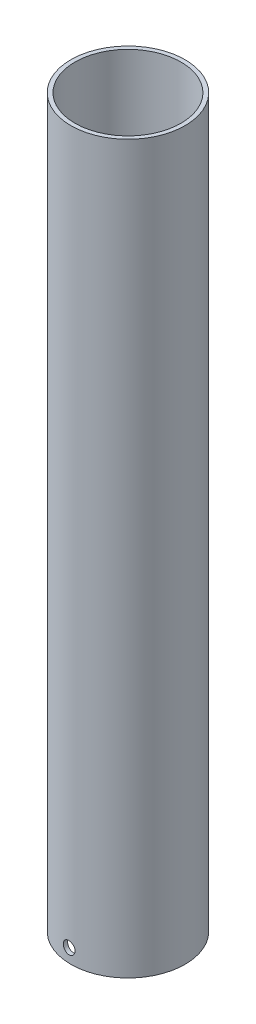
ISO-10303-21;
HEADER;
FILE_DESCRIPTION(('STEP AP214'),'2;1');
FILE_NAME('part.step','',(''),(''),'','','');
FILE_SCHEMA(('AUTOMOTIVE_DESIGN { 1 0 10303 214 1 1 1 1 }'));
ENDSEC;
DATA;
#1=APPLICATION_CONTEXT('core data for automotive mechanical design processes');
#2=APPLICATION_PROTOCOL_DEFINITION('international standard','automotive_design',2000,#1);
#3=PRODUCT_CONTEXT('',#1,'mechanical');
#4=PRODUCT('Part','Part','',(#3));
#5=PRODUCT_RELATED_PRODUCT_CATEGORY('part','',(#4));
#6=PRODUCT_DEFINITION_FORMATION('','',#4);
#7=PRODUCT_DEFINITION_CONTEXT('part definition',#1,'design');
#8=PRODUCT_DEFINITION('design','',#6,#7);
#9=PRODUCT_DEFINITION_SHAPE('','',#8);
#10=(LENGTH_UNIT() NAMED_UNIT(*) SI_UNIT(.MILLI.,.METRE.));
#11=(NAMED_UNIT(*) PLANE_ANGLE_UNIT() SI_UNIT($,.RADIAN.));
#12=(NAMED_UNIT(*) SI_UNIT($,.STERADIAN.) SOLID_ANGLE_UNIT());
#13=UNCERTAINTY_MEASURE_WITH_UNIT(LENGTH_MEASURE(1.E-05),#10,'distance_accuracy_value','');
#14=(GEOMETRIC_REPRESENTATION_CONTEXT(3) GLOBAL_UNCERTAINTY_ASSIGNED_CONTEXT((#13)) GLOBAL_UNIT_ASSIGNED_CONTEXT((#10,
#11,#12)) REPRESENTATION_CONTEXT('',''));
#15=CARTESIAN_POINT('',(0.,0.,0.));
#16=DIRECTION('',(0.,0.,1.));
#17=DIRECTION('',(1.,0.,0.));
#18=AXIS2_PLACEMENT_3D('',#15,#16,#17);
#19=CARTESIAN_POINT('',(0.,178.,0.));
#20=DIRECTION('',(0.,1.,0.));
#21=DIRECTION('',(0.,0.,1.));
#22=AXIS2_PLACEMENT_3D('',#19,#20,#21);
#23=PLANE('',#22);
#24=CARTESIAN_POINT('',(0.,178.,0.));
#25=DIRECTION('',(0.,1.,0.));
#26=DIRECTION('',(0.,0.,1.));
#27=AXIS2_PLACEMENT_3D('',#24,#25,#26);
#28=CIRCLE('',#27,14.);
#29=CARTESIAN_POINT('',(0.,178.,14.));
#30=VERTEX_POINT('',#29);
#31=EDGE_CURVE('E10',#30,#30,#28,.T.);
#32=ORIENTED_EDGE('',*,*,#31,.T.);
#33=EDGE_LOOP('',(#32));
#34=FACE_BOUND('',#33,.T.);
#35=CARTESIAN_POINT('',(0.,178.,0.));
#36=DIRECTION('',(0.,1.,0.));
#37=DIRECTION('',(0.,0.,1.));
#38=AXIS2_PLACEMENT_3D('',#35,#36,#37);
#39=CIRCLE('',#38,13.);
#40=CARTESIAN_POINT('',(0.,178.,13.));
#41=VERTEX_POINT('',#40);
#42=EDGE_CURVE('E51',#41,#41,#39,.T.);
#43=ORIENTED_EDGE('',*,*,#42,.F.);
#44=EDGE_LOOP('',(#43));
#45=FACE_BOUND('',#44,.T.);
#46=ADVANCED_FACE('F32',(#34,#45),#23,.T.);
#47=CARTESIAN_POINT('',(0.,0.,0.));
#48=DIRECTION('',(0.,1.,0.));
#49=DIRECTION('',(0.,0.,1.));
#50=AXIS2_PLACEMENT_3D('',#47,#48,#49);
#51=PLANE('',#50);
#52=CARTESIAN_POINT('',(0.,0.,0.));
#53=DIRECTION('',(0.,1.,0.));
#54=DIRECTION('',(0.,0.,1.));
#55=AXIS2_PLACEMENT_3D('',#52,#53,#54);
#56=CIRCLE('',#55,14.);
#57=CARTESIAN_POINT('',(0.,0.,14.));
#58=VERTEX_POINT('',#57);
#59=EDGE_CURVE('E46',#58,#58,#56,.T.);
#60=ORIENTED_EDGE('',*,*,#59,.F.);
#61=EDGE_LOOP('',(#60));
#62=FACE_BOUND('',#61,.T.);
#63=CARTESIAN_POINT('',(0.,0.,0.));
#64=DIRECTION('',(0.,1.,0.));
#65=DIRECTION('',(0.,0.,1.));
#66=AXIS2_PLACEMENT_3D('',#63,#64,#65);
#67=CIRCLE('',#66,13.);
#68=CARTESIAN_POINT('',(0.,0.,13.));
#69=VERTEX_POINT('',#68);
#70=EDGE_CURVE('E54',#69,#69,#67,.T.);
#71=ORIENTED_EDGE('',*,*,#70,.T.);
#72=EDGE_LOOP('',(#71));
#73=FACE_BOUND('',#72,.T.);
#74=ADVANCED_FACE('F90',(#62,#73),#51,.F.);
#75=CARTESIAN_POINT('',(0.,178.,0.));
#76=DIRECTION('',(0.,-1.,0.));
#77=DIRECTION('',(0.,0.,-1.));
#78=AXIS2_PLACEMENT_3D('',#75,#76,#77);
#79=CYLINDRICAL_SURFACE('',#78,14.);
#80=CARTESIAN_POINT('',(0.,4.72088876512511,-14.));
#81=CARTESIAN_POINT('',(-0.0797635108235447,4.69339310558107,-13.9999992620599));
#82=CARTESIAN_POINT('',(-0.157260112589885,4.6591483632393,-13.9993120308647));
#83=CARTESIAN_POINT('',(-0.305464442159809,4.57813640790885,-13.9968642446644));
#84=CARTESIAN_POINT('',(-0.376164291097724,4.53135489443288,-13.9951024609884));
#85=CARTESIAN_POINT('',(-0.508677268794628,4.42664071286015,-13.9909128932974));
#86=CARTESIAN_POINT('',(-0.570495475391909,4.36871446113652,-13.9884854921587));
#87=CARTESIAN_POINT('',(-0.683525453825599,4.24333668313493,-13.9834188317392));
#88=CARTESIAN_POINT('',(-0.734739647028978,4.17588733733158,-13.9807796210152));
#89=CARTESIAN_POINT('',(-0.825195653870934,4.03322366325164,-13.9757330707817));
#90=CARTESIAN_POINT('',(-0.864417896339043,3.95799690691231,-13.973326114652));
#91=CARTESIAN_POINT('',(-0.929634536073645,3.80199314221514,-13.9691393435771));
#92=CARTESIAN_POINT('',(-0.955628824158422,3.72121608805215,-13.9673595338084));
#93=CARTESIAN_POINT('',(-0.993544532232519,3.5567362052991,-13.9647138443585));
#94=CARTESIAN_POINT('',(-1.0055196505497,3.47304581347829,-13.9638444787167));
#95=CARTESIAN_POINT('',(-1.01521977999673,3.30484017097782,-13.9631426872178));
#96=CARTESIAN_POINT('',(-1.01294521301607,3.22032494479294,-13.9633102306608));
#97=CARTESIAN_POINT('',(-0.994254882840361,3.05324277420335,-13.9646533148128));
#98=CARTESIAN_POINT('',(-0.977898501918738,2.97066914231391,-13.9658246226042));
#99=CARTESIAN_POINT('',(-0.931607159050394,2.80943753915253,-13.9689885706454));
#100=CARTESIAN_POINT('',(-0.901672031750464,2.73077961557651,-13.9709812208968));
#101=CARTESIAN_POINT('',(-0.829019251407501,2.57943031313419,-13.9754802306145));
#102=CARTESIAN_POINT('',(-0.786276096277451,2.50675121015375,-13.9779876117961));
#103=CARTESIAN_POINT('',(-0.689250321120806,2.36955673049665,-13.9831071771594));
#104=CARTESIAN_POINT('',(-0.634967296381392,2.30504164026534,-13.985719365014));
#105=CARTESIAN_POINT('',(-0.516087795436752,2.18566364677829,-13.990611205319));
#106=CARTESIAN_POINT('',(-0.451440394237031,2.13085137133377,-13.9928891035237));
#107=CARTESIAN_POINT('',(-0.313856535832561,2.03282882786167,-13.9966503820047));
#108=CARTESIAN_POINT('',(-0.240920068699055,1.98961857373134,-13.9981337613291));
#109=CARTESIAN_POINT('',(-0.0888003717115231,1.91602607546538,-13.9999248218657));
#110=CARTESIAN_POINT('',(-0.0096155331312365,1.88564714779878,-14.0002321992859));
#111=CARTESIAN_POINT('',(0.152724120647779,1.83862046506263,-13.9994020828519));
#112=CARTESIAN_POINT('',(0.235878800351517,1.82197224170318,-13.9982646382772));
#113=CARTESIAN_POINT('',(0.403355210195504,1.80294518466807,-13.9944376261198));
#114=CARTESIAN_POINT('',(0.48766920026805,1.80049665303678,-13.9917557109401));
#115=CARTESIAN_POINT('',(0.655453965316559,1.80975449158445,-13.9849000832809));
#116=CARTESIAN_POINT('',(0.73892475368215,1.82146063663668,-13.9807263945286));
#117=CARTESIAN_POINT('',(0.902451042795877,1.85863734024548,-13.971123016801));
#118=CARTESIAN_POINT('',(0.982514335215304,1.88407444915151,-13.9656963983649));
#119=CARTESIAN_POINT('',(1.13720116607759,1.94795622334032,-13.9539527075128));
#120=CARTESIAN_POINT('',(1.21182456576847,1.98640122026624,-13.947635612396));
#121=CARTESIAN_POINT('',(1.35383631181547,2.07537745417889,-13.9345699027685));
#122=CARTESIAN_POINT('',(1.42119604677487,2.12595412514893,-13.9278197377061));
#123=CARTESIAN_POINT('',(1.54649161490082,2.23769381509673,-13.9144651891281));
#124=CARTESIAN_POINT('',(1.60442717872748,2.29885713653461,-13.9078608097837));
#125=CARTESIAN_POINT('',(1.70948874828973,2.43034079625818,-13.8953397495995));
#126=CARTESIAN_POINT('',(1.75656864151849,2.50069827810975,-13.8894260532269));
#127=CARTESIAN_POINT('',(1.83827748839958,2.64839199160633,-13.8788486736999));
#128=CARTESIAN_POINT('',(1.87290661305541,2.72572812738564,-13.8741849733778));
#129=CARTESIAN_POINT('',(1.92866610451736,2.88503244955425,-13.8665440158583));
#130=CARTESIAN_POINT('',(1.94982275141657,2.96699127644176,-13.8635634766963));
#131=CARTESIAN_POINT('',(1.97812823092718,3.13333860545741,-13.8595532509254));
#132=CARTESIAN_POINT('',(1.98527756989194,3.21772701964595,-13.8585234937971));
#133=CARTESIAN_POINT('',(1.98535970270921,3.38608048731759,-13.8585116949467));
#134=CARTESIAN_POINT('',(1.97836451795362,3.47004551414629,-13.8595192794438));
#135=CARTESIAN_POINT('',(1.95050610439492,3.63559480036806,-13.8634671333802));
#136=CARTESIAN_POINT('',(1.92964286221101,3.71717905746393,-13.8664074046842));
#137=CARTESIAN_POINT('',(1.87465633752798,3.87564245305652,-13.8739478129717));
#138=CARTESIAN_POINT('',(1.84053638561028,3.9525227677485,-13.8785475330189));
#139=CARTESIAN_POINT('',(1.76000113221841,4.09945632829071,-13.8889898008667));
#140=CARTESIAN_POINT('',(1.71358540518043,4.16950933772918,-13.8948323916823));
#141=CARTESIAN_POINT('',(1.60948996457125,4.3011738748067,-13.9072749038819));
#142=CARTESIAN_POINT('',(1.55175527815836,4.36274160171777,-13.9138784537712));
#143=CARTESIAN_POINT('',(1.42677667594501,4.47529664115151,-13.9272484523821));
#144=CARTESIAN_POINT('',(1.35953292632865,4.52628413853998,-13.9340148982553));
#145=CARTESIAN_POINT('',(1.21723304715326,4.61634847206328,-13.9471665170155));
#146=CARTESIAN_POINT('',(1.14215888514948,4.65539696409989,-13.9535507540796));
#147=CARTESIAN_POINT('',(0.986420959780283,4.72029968602371,-13.9654239377167));
#148=CARTESIAN_POINT('',(0.905756107654083,4.74615133764122,-13.9709127092));
#149=CARTESIAN_POINT('',(0.741436990979675,4.78382723839678,-13.9805944947035));
#150=CARTESIAN_POINT('',(0.657793855730715,4.7956990102907,-13.9847918625169));
#151=CARTESIAN_POINT('',(0.48970484003717,4.80520999066528,-13.9916848059477));
#152=CARTESIAN_POINT('',(0.40525996062271,4.80286508215184,-13.9943820538347));
#153=CARTESIAN_POINT('',(0.266917456254927,4.78732562145902,-13.9975630626396));
#154=CARTESIAN_POINT('',(0.212544614088711,4.77815892920459,-13.9984895951989));
#155=CARTESIAN_POINT('',(0.105125715260214,4.75391679941058,-13.9997083032793));
#156=CARTESIAN_POINT('',(0.0520796522834105,4.73884138999796,-14.0000004818201));
#157=CARTESIAN_POINT('',(0.,4.72088876512511,-14.));
#158=B_SPLINE_CURVE_WITH_KNOTS('',3,(#80,#81,#82,#83,#84,#85,#86,#87,#88,#89,#90,#91,#92,#93,
#94,#95,#96,#97,#98,#99,#100,#101,#102,#103,#104,#105,#106,#107,#108,#109,#110,#111,#112,#113,
#114,#115,#116,#117,#118,#119,#120,#121,#122,#123,#124,#125,#126,#127,#128,#129,#130,#131,#132,
#133,#134,#135,#136,#137,#138,#139,#140,#141,#142,#143,#144,#145,#146,#147,#148,#149,#150,#151,
#152,#153,#154,#155,#156,#157),.UNSPECIFIED.,.T.,.F.,(4,2,2,2,2,2,2,2,2,2,2,2,2,2,2,2,2,2,2,2,2,
2,2,2,2,2,2,2,2,2,2,2,2,2,2,2,2,2,4),(0.,0.252907314269152,0.506104352810428,0.759156051800122,
1.0121499039734,1.2655544713306,1.51896113022035,1.77139394373454,2.02381928352233,
2.2751853437778,2.52655446508909,2.7784274517169,3.03030927319742,3.28346893880425,
3.53662890765234,3.78985426990943,4.04307099548016,4.29504376974827,4.5470125365029,
4.79837024056192,5.04973435360462,5.30205495926258,5.55438277489902,5.80776345028,
6.0611406455031,6.31402206406657,6.56689434099358,6.81848227988813,7.07007046153124,
7.32159547564104,7.57312919631313,7.82591623762139,8.07869886167028,8.33207703247249,
8.58550468689778,8.83806833746899,9.09034987364535,9.255480364385,9.42061006907173),.UNSPECIFIED.);
#159=CARTESIAN_POINT('',(0.,4.72088876512511,-14.));
#160=VERTEX_POINT('',#159);
#161=EDGE_CURVE('E79',#160,#160,#158,.T.);
#162=ORIENTED_EDGE('',*,*,#161,.T.);
#163=EDGE_LOOP('',(#162));
#164=FACE_BOUND('',#163,.T.);
#165=CARTESIAN_POINT('',(1.01285014362451,3.30285119422655,13.9633138826913));
#166=CARTESIAN_POINT('',(1.01284648705991,3.21885538595477,13.9633148056659));
#167=CARTESIAN_POINT('',(1.00574854922952,3.13480483800236,13.9638346260441));
#168=CARTESIAN_POINT('',(0.977544231768609,2.96903638798496,13.9658368685742));
#169=CARTESIAN_POINT('',(0.956422624695876,2.88732112237301,13.9673203370544));
#170=CARTESIAN_POINT('',(0.90080170080025,2.72864767930527,13.9710174411756));
#171=CARTESIAN_POINT('',(0.866310749007334,2.65168656207896,13.9732306201167));
#172=CARTESIAN_POINT('',(0.784956830389881,2.50464506719866,13.9780361738083));
#173=CARTESIAN_POINT('',(0.738096230339055,2.43456337676987,13.9806284759761));
#174=CARTESIAN_POINT('',(0.633136820423465,2.30296310718316,13.9857749377353));
#175=CARTESIAN_POINT('',(0.57499709946188,2.2414771469766,13.9883289208618));
#176=CARTESIAN_POINT('',(0.44923126607844,2.12909482987074,13.9929318845463));
#177=CARTESIAN_POINT('',(0.381604710121209,2.07819896836383,13.9949808414805));
#178=CARTESIAN_POINT('',(0.238596099047082,1.9883275295309,13.9981495827523));
#179=CARTESIAN_POINT('',(0.163195717293742,1.94938102263876,13.9992671122602));
#180=CARTESIAN_POINT('',(0.00691867206756053,1.88469987031771,14.0002161168344));
#181=CARTESIAN_POINT('',(-0.0739578395576291,1.85896485871681,14.0000476275462));
#182=CARTESIAN_POINT('',(-0.238552517834361,1.82153344103466,13.9982083432138));
#183=CARTESIAN_POINT('',(-0.3222585146272,1.80978324517983,13.9965433478633));
#184=CARTESIAN_POINT('',(-0.490409382716156,1.80048849778377,13.9916607904654));
#185=CARTESIAN_POINT('',(-0.574854232167255,1.80294352765648,13.9884432741687));
#186=CARTESIAN_POINT('',(-0.741721519295648,1.82194602585638,13.9805865335754));
#187=CARTESIAN_POINT('',(-0.824150831409613,1.83843565198852,13.9759531946181));
#188=CARTESIAN_POINT('',(-0.985021085879627,1.88494907076036,13.9655374058251));
#189=CARTESIAN_POINT('',(-1.06346196990644,1.91497306127164,13.9597549391899));
#190=CARTESIAN_POINT('',(-1.21431862956592,1.98776585442848,13.9474433363424));
#191=CARTESIAN_POINT('',(-1.28672200229959,2.03056010410708,13.9409127254791));
#192=CARTESIAN_POINT('',(-1.42332546621671,2.12766015905342,13.9276294452526));
#193=CARTESIAN_POINT('',(-1.48752528088867,2.18196635218208,13.9208767684141));
#194=CARTESIAN_POINT('',(-1.60625034070899,2.30087369780344,13.9076796543417));
#195=CARTESIAN_POINT('',(-1.66072536931849,2.3655251930076,13.9012369358192));
#196=CARTESIAN_POINT('',(-1.75807949688782,2.50311380644594,13.8892609599217));
#197=CARTESIAN_POINT('',(-1.80095857467184,2.57605093981049,13.8837277042075));
#198=CARTESIAN_POINT('',(-1.87391613413695,2.72818064364848,13.8740693243437));
#199=CARTESIAN_POINT('',(-1.90399128086202,2.8073748374972,13.8699445671118));
#200=CARTESIAN_POINT('',(-1.9504555436341,2.9697504526314,13.8634872379991));
#201=CARTESIAN_POINT('',(-1.9668451398577,3.0529317339161,13.8611546032394));
#202=CARTESIAN_POINT('',(-1.9854134617984,3.22047850797291,13.8585072260736));
#203=CARTESIAN_POINT('',(-1.98766228622403,3.30483607837465,13.8581825300361));
#204=CARTESIAN_POINT('',(-1.97807027653809,3.47272848892748,13.8595548461327));
#205=CARTESIAN_POINT('',(-1.96622966154715,3.55626334185321,13.8612518268257));
#206=CARTESIAN_POINT('',(-1.9288498377965,3.7199323399825,13.8665024225974));
#207=CARTESIAN_POINT('',(-1.90334399162276,3.80007425674797,13.8700515153447));
#208=CARTESIAN_POINT('',(-1.83938406122355,3.95492442722934,13.8786779462202));
#209=CARTESIAN_POINT('',(-1.80092963810237,4.02963253866712,13.8837553243471));
#210=CARTESIAN_POINT('',(-1.71197838229093,4.17181468870577,13.8950041370047));
#211=CARTESIAN_POINT('',(-1.66143514154197,4.23925935976988,13.9011797636028));
#212=CARTESIAN_POINT('',(-1.54979412642238,4.36470183208707,13.9140679719998));
#213=CARTESIAN_POINT('',(-1.48869605177031,4.42269936448101,13.9207805690725));
#214=CARTESIAN_POINT('',(-1.35736124085859,4.52784520262101,13.9342002762313));
#215=CARTESIAN_POINT('',(-1.28708763621567,4.57494749151594,13.9409072479727));
#216=CARTESIAN_POINT('',(-1.13956445046538,4.65664866762205,13.953740261053));
#217=CARTESIAN_POINT('',(-1.0623149771414,4.69124774797765,13.9598663113647));
#218=CARTESIAN_POINT('',(-0.903181070861745,4.74688291419386,13.9710632351685));
#219=CARTESIAN_POINT('',(-0.821306396898214,4.76794647629079,13.9761362320212));
#220=CARTESIAN_POINT('',(-0.655109936171472,4.79600229028736,13.9849115811784));
#221=CARTESIAN_POINT('',(-0.570788229178976,4.80299500036051,13.9886139781092));
#222=CARTESIAN_POINT('',(-0.402540057926672,4.80270361930412,13.9944636263302));
#223=CARTESIAN_POINT('',(-0.318613728597328,4.79549083559284,13.9966185712853));
#224=CARTESIAN_POINT('',(-0.153121219812696,4.76714313390559,13.9994073277374));
#225=CARTESIAN_POINT('',(-0.0715550414142321,4.7460082096957,14.0000411385534));
#226=CARTESIAN_POINT('',(0.0868924147998663,4.69043664734946,13.9999546607882));
#227=CARTESIAN_POINT('',(0.163774551361408,4.65600245597352,13.9992346211903));
#228=CARTESIAN_POINT('',(0.310713000297716,4.57481731018752,13.9967447609729));
#229=CARTESIAN_POINT('',(0.380769320239169,4.52806636943127,13.9949749415172));
#230=CARTESIAN_POINT('',(0.512421120902768,4.42330815941211,13.9907752004868));
#231=CARTESIAN_POINT('',(0.573974226759718,4.36524776094532,13.9883421407272));
#232=CARTESIAN_POINT('',(0.686496685434769,4.239625681844,13.9832722761131));
#233=CARTESIAN_POINT('',(0.737463504724527,4.17206173327731,13.980635422693));
#234=CARTESIAN_POINT('',(0.827472695699053,4.02913404221941,13.975597777505));
#235=CARTESIAN_POINT('',(0.866480309267852,3.95374840098948,13.973197687321));
#236=CARTESIAN_POINT('',(0.931201506900004,3.79752129623902,13.9690345092011));
#237=CARTESIAN_POINT('',(0.956929945241701,3.71668604372179,13.9672707101688));
#238=CARTESIAN_POINT('',(0.988005350085735,3.57997768342238,13.9650989859592));
#239=CARTESIAN_POINT('',(0.997309124073729,3.52497574107336,13.9644338876406));
#240=CARTESIAN_POINT('',(1.00973271825263,3.41427429208773,13.9635410309472));
#241=CARTESIAN_POINT('',(1.01285256942323,3.35857478894711,13.9633132703815));
#242=CARTESIAN_POINT('',(1.01285014362451,3.30285119422655,13.9633138826913));
#243=B_SPLINE_CURVE_WITH_KNOTS('',3,(#165,#166,#167,#168,#169,#170,#171,#172,#173,#174,#175,
#176,#177,#178,#179,#180,#181,#182,#183,#184,#185,#186,#187,#188,#189,#190,#191,#192,#193,#194,
#195,#196,#197,#198,#199,#200,#201,#202,#203,#204,#205,#206,#207,#208,#209,#210,#211,#212,#213,
#214,#215,#216,#217,#218,#219,#220,#221,#222,#223,#224,#225,#226,#227,#228,#229,#230,#231,#232,
#233,#234,#235,#236,#237,#238,#239,#240,#241,#242),.UNSPECIFIED.,.T.,.F.,(4,2,2,2,2,2,2,2,2,2,2,
2,2,2,2,2,2,2,2,2,2,2,2,2,2,2,2,2,2,2,2,2,2,2,2,2,2,2,4),(0.,0.251783913330532,
0.503841671467258,0.755741974162372,1.00759411385448,1.26037744147798,1.51317259135174,
1.76657795292632,2.01997629069676,2.27239680021158,2.52480987167732,2.77618765734666,
3.02756911826312,3.27945488538695,3.53134914040661,3.7845086939751,4.0376687098446,
4.29089462436262,4.54411165372384,4.79607243820295,5.0480293042091,5.29937382188553,
5.55072491836985,5.80305687391892,6.05539600940943,6.3087822119636,6.5621645001445,
6.81503079998949,7.06788886589705,7.31948089314306,7.57107303304474,7.82261890778983,
8.07416450368323,8.32692161440707,8.57973914587836,8.83328464632587,9.08654590902362,
9.25358251859521,9.42061829135887),.UNSPECIFIED.);
#244=CARTESIAN_POINT('',(1.01285014362451,3.30285119422655,13.9633138826913));
#245=VERTEX_POINT('',#244);
#246=EDGE_CURVE('E74',#245,#245,#243,.T.);
#247=ORIENTED_EDGE('',*,*,#246,.T.);
#248=EDGE_LOOP('',(#247));
#249=FACE_BOUND('',#248,.T.);
#250=ORIENTED_EDGE('',*,*,#31,.F.);
#251=EDGE_LOOP('',(#250));
#252=FACE_BOUND('',#251,.T.);
#253=ORIENTED_EDGE('',*,*,#59,.T.);
#254=EDGE_LOOP('',(#253));
#255=FACE_BOUND('',#254,.T.);
#256=ADVANCED_FACE('F34',(#164,#249,#252,#255),#79,.T.);
#257=CARTESIAN_POINT('',(0.,178.,0.));
#258=DIRECTION('',(0.,-1.,0.));
#259=DIRECTION('',(0.,0.,-1.));
#260=AXIS2_PLACEMENT_3D('',#257,#258,#259);
#261=CYLINDRICAL_SURFACE('',#260,13.);
#262=CARTESIAN_POINT('',(0.,4.73245861031252,-13.));
#263=CARTESIAN_POINT('',(-0.0804064586417225,4.70692919555048,-12.9999991771779));
#264=CARTESIAN_POINT('',(-0.15871183106156,4.67459887067572,-12.999247000565));
#265=CARTESIAN_POINT('',(-0.308842228217681,4.59726067774533,-12.9965486838111));
#266=CARTESIAN_POINT('',(-0.380659799639643,4.55223846754276,-12.9946011899839));
#267=CARTESIAN_POINT('',(-0.515685371134309,4.45084013161236,-12.9899435497534));
#268=CARTESIAN_POINT('',(-0.578898573971684,4.39447091860475,-12.9872338672865));
#269=CARTESIAN_POINT('',(-0.694965060674597,4.27195851570318,-12.9815410640923));
#270=CARTESIAN_POINT('',(-0.747820636080606,4.20581749343463,-12.9785580040624));
#271=CARTESIAN_POINT('',(-0.841795554475505,4.06543819583225,-12.9728026618418));
#272=CARTESIAN_POINT('',(-0.882888281768813,3.99118207456631,-12.9700308679094));
#273=CARTESIAN_POINT('',(-0.951981234909894,3.83678633610187,-12.9651431988051));
#274=CARTESIAN_POINT('',(-0.979981387211497,3.75664668585617,-12.9630273273179));
#275=CARTESIAN_POINT('',(-1.02197013925803,3.59310214673446,-12.9597848283718));
#276=CARTESIAN_POINT('',(-1.03601484952013,3.50971174631896,-12.9586542416622));
#277=CARTESIAN_POINT('',(-1.04986760815907,3.34175050449426,-12.9575394291997));
#278=CARTESIAN_POINT('',(-1.04967617397993,3.25717970610095,-12.9575551617814));
#279=CARTESIAN_POINT('',(-1.03510208677473,3.08972312660666,-12.9587273576487));
#280=CARTESIAN_POINT('',(-1.0207931076704,3.0068308773443,-12.9598778988049));
#281=CARTESIAN_POINT('',(-0.978519427458492,2.84462579950725,-12.9631379249466));
#282=CARTESIAN_POINT('',(-0.950554578633935,2.76531300966209,-12.9652474203052));
#283=CARTESIAN_POINT('',(-0.881724898939274,2.61235198579932,-12.9701097566605));
#284=CARTESIAN_POINT('',(-0.840837291066022,2.53871404122288,-12.972863731342));
#285=CARTESIAN_POINT('',(-0.747348854831968,2.39930055995949,-12.9785844897382));
#286=CARTESIAN_POINT('',(-0.694747547892544,2.3335253446835,-12.9815512821443));
#287=CARTESIAN_POINT('',(-0.578965712510239,2.21129122485201,-12.9872310256427));
#288=CARTESIAN_POINT('',(-0.515723965251994,2.15489021761159,-12.9899423574344));
#289=CARTESIAN_POINT('',(-0.380665745412957,2.05346940760537,-12.9946008459731));
#290=CARTESIAN_POINT('',(-0.308849224718601,2.00844966870495,-12.996547998432));
#291=CARTESIAN_POINT('',(-0.158599355846236,1.9310412218601,-12.9992495814897));
#292=CARTESIAN_POINT('',(-0.0801601794317293,1.8986637836437,-13.0000029497341));
#293=CARTESIAN_POINT('',(0.0810418394251829,1.84754403192136,-12.9999970353469));
#294=CARTESIAN_POINT('',(0.16380451546609,1.82880119406499,-12.9992378108899));
#295=CARTESIAN_POINT('',(0.330810282540154,1.80557070205231,-12.9960570794088));
#296=CARTESIAN_POINT('',(0.415042708116538,1.80100509619577,-12.9936447516));
#297=CARTESIAN_POINT('',(0.583018501396132,1.80604419612652,-12.9871919135668));
#298=CARTESIAN_POINT('',(0.66676187972693,1.81564859282343,-12.9831514388587));
#299=CARTESIAN_POINT('',(0.831099592454222,1.8486868726304,-12.9736667609539));
#300=CARTESIAN_POINT('',(0.911703438621804,1.87207484312448,-12.9682272516395));
#301=CARTESIAN_POINT('',(1.0678003188889,1.93196351471823,-12.9563087109501));
#302=CARTESIAN_POINT('',(1.14329321689056,1.96846456483896,-12.9498296519087));
#303=CARTESIAN_POINT('',(1.28736989408016,2.05371082704771,-12.9363032570484));
#304=CARTESIAN_POINT('',(1.35592490013732,2.10250431843515,-12.9292537566847));
#305=CARTESIAN_POINT('',(1.48389400435831,2.21089067200626,-12.9151930084078));
#306=CARTESIAN_POINT('',(1.543307779837,2.27048391525914,-12.9081817618534));
#307=CARTESIAN_POINT('',(1.65163631844579,2.3991466221246,-12.8947702470073));
#308=CARTESIAN_POINT('',(1.7004953398729,2.46826338426446,-12.8883733171119));
#309=CARTESIAN_POINT('',(1.78594761922836,2.61379800821597,-12.8768108565036));
#310=CARTESIAN_POINT('',(1.82254102264116,2.69021578341534,-12.8716453111853));
#311=CARTESIAN_POINT('',(1.88236292493465,2.84805984481545,-12.863033368016));
#312=CARTESIAN_POINT('',(1.9056138840427,2.9294774571051,-12.8595840823795));
#313=CARTESIAN_POINT('',(1.9381669047645,3.09511290154669,-12.854718343717));
#314=CARTESIAN_POINT('',(1.94746956114391,3.17933061414379,-12.8533018040132));
#315=CARTESIAN_POINT('',(1.9518396770319,3.34763825914548,-12.8526388997573));
#316=CARTESIAN_POINT('',(1.94699176372029,3.43172595438042,-12.8533796336169));
#317=CARTESIAN_POINT('',(1.92338585466484,3.59787958354759,-12.8569330269592));
#318=CARTESIAN_POINT('',(1.90462790291028,3.67994552387259,-12.8597456798896));
#319=CARTESIAN_POINT('',(1.85376903859416,3.8396617948313,-12.8671750927233));
#320=CARTESIAN_POINT('',(1.82168020781497,3.91731605151944,-12.871790218818));
#321=CARTESIAN_POINT('',(1.74507100344112,4.06612663894474,-12.8823994559362));
#322=CARTESIAN_POINT('',(1.70055015247223,4.13728272002071,-12.8883936199116));
#323=CARTESIAN_POINT('',(1.60003384615626,4.27150537400536,-12.9012582827193));
#324=CARTESIAN_POINT('',(1.54397567842919,4.33452453501513,-12.9081334900473));
#325=CARTESIAN_POINT('',(1.42209467658827,4.4502472144925,-12.9221283486411));
#326=CARTESIAN_POINT('',(1.35627194364525,4.50295083982645,-12.9292479973736));
#327=CARTESIAN_POINT('',(1.21644945611336,4.59671726517663,-12.9431524440687));
#328=CARTESIAN_POINT('',(1.14242360340802,4.63774133851343,-12.9499360678326));
#329=CARTESIAN_POINT('',(0.988428070743486,4.70674070545647,-12.9625989517318));
#330=CARTESIAN_POINT('',(0.908457264982043,4.73471352019647,-12.9684780399239));
#331=CARTESIAN_POINT('',(0.745161948013821,4.77670131854916,-12.9788829739318));
#332=CARTESIAN_POINT('',(0.66185054343264,4.79076617684874,-12.9834136141812));
#333=CARTESIAN_POINT('',(0.494041468170577,4.80468044049116,-12.990879710114));
#334=CARTESIAN_POINT('',(0.409545213041502,4.80454556780919,-12.9938169264171));
#335=CARTESIAN_POINT('',(0.270429828912305,4.79258887934509,-12.9973052371561));
#336=CARTESIAN_POINT('',(0.215446528696139,4.78476740831926,-12.9983284376423));
#337=CARTESIAN_POINT('',(0.106672551726054,4.76309737316931,-12.999676087675));
#338=CARTESIAN_POINT('',(0.0528818682599034,4.74924884297548,-13.0000005411551));
#339=CARTESIAN_POINT('',(0.,4.73245861031252,-13.));
#340=B_SPLINE_CURVE_WITH_KNOTS('',3,(#262,#263,#264,#265,#266,#267,#268,#269,#270,#271,#272,
#273,#274,#275,#276,#277,#278,#279,#280,#281,#282,#283,#284,#285,#286,#287,#288,#289,#290,#291,
#292,#293,#294,#295,#296,#297,#298,#299,#300,#301,#302,#303,#304,#305,#306,#307,#308,#309,#310,
#311,#312,#313,#314,#315,#316,#317,#318,#319,#320,#321,#322,#323,#324,#325,#326,#327,#328,#329,
#330,#331,#332,#333,#334,#335,#336,#337,#338,#339),.UNSPECIFIED.,.T.,.F.,(4,2,2,2,2,2,2,2,2,2,2,
2,2,2,2,2,2,2,2,2,2,2,2,2,2,2,2,2,2,2,2,2,2,2,2,2,2,2,4),(0.,0.252882981361675,0.50605288025932,
0.759069009492832,1.01202909761773,1.26555711199332,1.51908655051888,1.77159245008808,
2.02408917177874,2.27527514480581,2.52646383499825,2.77809775015267,3.02974194802935,
3.28288683380968,3.5360331400678,3.78940459618483,4.04276630779497,4.29473245314504,
4.54669310243704,4.79781918546076,5.04895195301503,5.30108687043951,5.55323068617689,
5.80667522073089,6.06011674903234,6.31313038122028,6.56613322441849,6.81762609545709,
7.06911817117489,7.32038281502376,7.57165710845204,7.82433512175579,8.07701051724067,
8.33051421932245,8.58406605057208,8.83670529756096,9.08906482473264,9.25538230738124,
9.42169885373142),.UNSPECIFIED.);
#341=CARTESIAN_POINT('',(0.,4.73245861031252,-13.));
#342=VERTEX_POINT('',#341);
#343=EDGE_CURVE('E37',#342,#342,#340,.T.);
#344=ORIENTED_EDGE('',*,*,#343,.F.);
#345=EDGE_LOOP('',(#344));
#346=FACE_BOUND('',#345,.T.);
#347=CARTESIAN_POINT('',(1.04800020645703,3.30285119422655,12.957688666088));
#348=CARTESIAN_POINT('',(1.04799657073158,3.21889697692693,12.9576896627547));
#349=CARTESIAN_POINT('',(1.0409035382826,3.13488903758119,12.9582686871717));
#350=CARTESIAN_POINT('',(1.01272051292783,2.96920749188068,12.960501119848));
#351=CARTESIAN_POINT('',(0.991615565609228,2.88753647688711,12.962155675944));
#352=CARTESIAN_POINT('',(0.9360431124048,2.72895177934293,12.9662868539699));
#353=CARTESIAN_POINT('',(0.901584277741771,2.65203504714586,12.9687629422956));
#354=CARTESIAN_POINT('',(0.820310834353909,2.50507363670939,12.9741566549034));
#355=CARTESIAN_POINT('',(0.773498477759954,2.43502770906525,12.9770741986637));
#356=CARTESIAN_POINT('',(0.668619722021437,2.30344541778755,12.982900668031));
#357=CARTESIAN_POINT('',(0.610506092885384,2.2419466912615,12.9858095035544));
#358=CARTESIAN_POINT('',(0.484790773918597,2.12952924174356,12.9911095743194));
#359=CARTESIAN_POINT('',(0.417188628184512,2.07861102741489,12.993500784676));
#360=CARTESIAN_POINT('',(0.274194389587787,1.98866672646937,12.9973050804517));
#361=CARTESIAN_POINT('',(0.198780955725443,1.94967443420335,12.9987154004599));
#362=CARTESIAN_POINT('',(0.0424653053707529,1.88490516502487,13.0001653493608));
#363=CARTESIAN_POINT('',(-0.0384367361218553,1.85912776699041,13.000205021935));
#364=CARTESIAN_POINT('',(-0.203041106258481,1.82163172768746,12.9986735811468));
#365=CARTESIAN_POINT('',(-0.286729302177346,1.8098507629684,12.9971096667233));
#366=CARTESIAN_POINT('',(-0.454847355262418,1.80048898540741,12.9923124904023));
#367=CARTESIAN_POINT('',(-0.539277187233162,1.80290769201143,12.9890792850014));
#368=CARTESIAN_POINT('',(-0.706059500061207,1.82182638955858,12.9810792949359));
#369=CARTESIAN_POINT('',(-0.788419950739924,1.83825935848913,12.9763198767435));
#370=CARTESIAN_POINT('',(-0.949158493304794,1.88463548641504,12.9655540176337));
#371=CARTESIAN_POINT('',(-1.02753651908146,1.914578869606,12.9595475560234));
#372=CARTESIAN_POINT('',(-1.17830338003272,1.98719802250716,12.9467117339626));
#373=CARTESIAN_POINT('',(-1.2506779517839,2.0299030643955,12.9398805033949));
#374=CARTESIAN_POINT('',(-1.38724130529414,2.12681201964675,12.9259537572003));
#375=CARTESIAN_POINT('',(-1.45142976692817,2.18101638248006,12.9188582312519));
#376=CARTESIAN_POINT('',(-1.57020485941241,2.29976134146784,12.9049626401701));
#377=CARTESIAN_POINT('',(-1.6247333834409,2.36436030530824,12.8981645367859));
#378=CARTESIAN_POINT('',(-1.72220524545553,2.50185947369833,12.8855125054948));
#379=CARTESIAN_POINT('',(-1.76514855612235,2.5747596978228,12.8796585798142));
#380=CARTESIAN_POINT('',(-1.83824571318664,2.72684089172662,12.8694297486028));
#381=CARTESIAN_POINT('',(-1.86839535526345,2.80602391606055,12.8650553293705));
#382=CARTESIAN_POINT('',(-1.91501017021593,2.96839807082914,12.8581995704594));
#383=CARTESIAN_POINT('',(-1.93147590215911,3.05158903736906,12.8557181534408));
#384=CARTESIAN_POINT('',(-1.95018546088812,3.21910537093073,12.8528933424557));
#385=CARTESIAN_POINT('',(-1.95251053256918,3.30342146266057,12.8525377348934));
#386=CARTESIAN_POINT('',(-1.94308753679598,3.47124383116085,12.8539656386902));
#387=CARTESIAN_POINT('',(-1.93133972396291,3.55475012255547,12.8557491113468));
#388=CARTESIAN_POINT('',(-1.89416860396501,3.71834060381603,12.8612780508293));
#389=CARTESIAN_POINT('',(-1.86878426629179,3.79843384671533,12.8650179259926));
#390=CARTESIAN_POINT('',(-1.80509228015464,3.95320714727627,12.8741085380131));
#391=CARTESIAN_POINT('',(-1.7667842417648,4.02788704152711,12.8794593234731));
#392=CARTESIAN_POINT('',(-1.6781191493672,4.17008417364401,12.8913117282123));
#393=CARTESIAN_POINT('',(-1.62770848360685,4.23756755553241,12.8978184336159));
#394=CARTESIAN_POINT('',(-1.51633116777398,4.3631114864507,12.9113856353725));
#395=CARTESIAN_POINT('',(-1.45536416879329,4.42117172390368,12.918446150026));
#396=CARTESIAN_POINT('',(-1.324235972331,4.52650581860398,12.9325465403055));
#397=CARTESIAN_POINT('',(-1.25403177160499,4.57372619999927,12.9395861513498));
#398=CARTESIAN_POINT('',(-1.10661776793259,4.65567099118903,12.9530254155449));
#399=CARTESIAN_POINT('',(-1.02940808806188,4.69039562046175,12.9594250799344));
#400=CARTESIAN_POINT('',(-0.870344915794479,4.74627394646011,12.9710770089943));
#401=CARTESIAN_POINT('',(-0.78850267876356,4.76745911813653,12.9763319159628));
#402=CARTESIAN_POINT('',(-0.622342159730778,4.79575969507981,12.9853613424197));
#403=CARTESIAN_POINT('',(-0.538023972182794,4.80287563636134,12.989135918302));
#404=CARTESIAN_POINT('',(-0.369825676678532,4.80282676664199,12.9950094254432));
#405=CARTESIAN_POINT('',(-0.285945867900839,4.79574463855866,12.9971179592604));
#406=CARTESIAN_POINT('',(-0.120521445808687,4.76767507202925,12.9997046220318));
#407=CARTESIAN_POINT('',(-0.0389768324417402,4.74668763389571,13.0001827510228));
#408=CARTESIAN_POINT('',(0.119448815714141,4.69142795065765,12.9996927151696));
#409=CARTESIAN_POINT('',(0.196331017966465,4.65715904723661,12.9987249139541));
#410=CARTESIAN_POINT('',(0.343302001252591,4.57631779566539,12.9956744098953));
#411=CARTESIAN_POINT('',(0.413390750389523,4.52974538975118,12.9935917018175));
#412=CARTESIAN_POINT('',(0.545196047193218,4.42531127769452,12.9887313577525));
#413=CARTESIAN_POINT('',(0.606863650162605,4.36738797382707,12.9859499055771));
#414=CARTESIAN_POINT('',(0.719639760014499,4.24202246677591,12.9801893667058));
#415=CARTESIAN_POINT('',(0.77074575029217,4.17457800133317,12.9772102331294));
#416=CARTESIAN_POINT('',(0.861074735589244,4.03183265682233,12.9715308147219));
#417=CARTESIAN_POINT('',(0.900257878793705,3.95650653670522,12.9688314845225));
#418=CARTESIAN_POINT('',(0.965333224072062,3.8003611142521,12.9641507942948));
#419=CARTESIAN_POINT('',(0.991240102350731,3.71954798995657,12.9621686421802));
#420=CARTESIAN_POINT('',(1.02270969305036,3.58239176573305,12.9597150772002));
#421=CARTESIAN_POINT('',(1.03218014671429,3.52691892227625,12.9589600231844));
#422=CARTESIAN_POINT('',(1.04482660145125,3.41525580965479,12.9579464854655));
#423=CARTESIAN_POINT('',(1.04800264087846,3.35906554486374,12.9576879987366));
#424=CARTESIAN_POINT('',(1.04800020645703,3.30285119422655,12.957688666088));
#425=B_SPLINE_CURVE_WITH_KNOTS('',3,(#347,#348,#349,#350,#351,#352,#353,#354,#355,#356,#357,
#358,#359,#360,#361,#362,#363,#364,#365,#366,#367,#368,#369,#370,#371,#372,#373,#374,#375,#376,
#377,#378,#379,#380,#381,#382,#383,#384,#385,#386,#387,#388,#389,#390,#391,#392,#393,#394,#395,
#396,#397,#398,#399,#400,#401,#402,#403,#404,#405,#406,#407,#408,#409,#410,#411,#412,#413,#414,
#415,#416,#417,#418,#419,#420,#421,#422,#423,#424),.UNSPECIFIED.,.T.,.F.,(4,2,2,2,2,2,2,2,2,2,2,
2,2,2,2,2,2,2,2,2,2,2,2,2,2,2,2,2,2,2,2,2,2,2,2,2,2,2,4),(0.,0.251657323704604,
0.503583664907422,0.755346693442435,1.00706385553883,1.25985651676709,1.51266132831388,
1.76617601105995,2.01968261449443,2.27205611924457,2.52442108306369,2.77558585790615,
3.02675480080052,3.27850434573874,3.53026373254708,3.78348957406517,4.03671601271496,
4.29002560360386,4.54332484481025,4.79516737460207,5.04700534786712,5.29812743542831,
5.54925710036778,5.80152043045278,6.05379209994303,6.30728275635409,6.56076896017988,
6.81366372459467,7.06654885394689,7.31796557646896,7.56938229334013,7.82073579352368,
8.07209047381423,8.32484896253007,8.57766760888504,8.83132224048159,9.08469586220932,
9.25320245654525,9.42170802410548),.UNSPECIFIED.);
#426=CARTESIAN_POINT('',(1.04800020645703,3.30285119422655,12.957688666088));
#427=VERTEX_POINT('',#426);
#428=EDGE_CURVE('E56',#427,#427,#425,.T.);
#429=ORIENTED_EDGE('',*,*,#428,.F.);
#430=EDGE_LOOP('',(#429));
#431=FACE_BOUND('',#430,.T.);
#432=ORIENTED_EDGE('',*,*,#42,.T.);
#433=EDGE_LOOP('',(#432));
#434=FACE_BOUND('',#433,.T.);
#435=ORIENTED_EDGE('',*,*,#70,.F.);
#436=EDGE_LOOP('',(#435));
#437=FACE_BOUND('',#436,.T.);
#438=ADVANCED_FACE('F61',(#346,#431,#434,#437),#261,.F.);
#439=CARTESIAN_POINT('',(0.505834593811673,3.30285119422656,-14.4716675298797));
#440=DIRECTION('',(-0.0349321096308529,0.,0.999389687617767));
#441=DIRECTION('',(0.999389687617767,0.,0.034932109630853));
#442=AXIS2_PLACEMENT_3D('',#439,#440,#441);
#443=CYLINDRICAL_SURFACE('',#442,1.5);
#444=ORIENTED_EDGE('',*,*,#428,.T.);
#445=EDGE_LOOP('',(#444));
#446=FACE_BOUND('',#445,.T.);
#447=ORIENTED_EDGE('',*,*,#246,.F.);
#448=EDGE_LOOP('',(#447));
#449=FACE_BOUND('',#448,.T.);
#450=ADVANCED_FACE('F67',(#446,#449),#443,.F.);
#451=ORIENTED_EDGE('',*,*,#343,.T.);
#452=EDGE_LOOP('',(#451));
#453=FACE_BOUND('',#452,.T.);
#454=ORIENTED_EDGE('',*,*,#161,.F.);
#455=EDGE_LOOP('',(#454));
#456=FACE_BOUND('',#455,.T.);
#457=ADVANCED_FACE('F64',(#453,#456),#443,.F.);
#458=CLOSED_SHELL('',(#46,#74,#256,#438,#450,#457));
#459=MANIFOLD_SOLID_BREP('B2',#458);
#460=ADVANCED_BREP_SHAPE_REPRESENTATION('',(#18,#459),#14);
#461=SHAPE_DEFINITION_REPRESENTATION(#9,#460);
ENDSEC;
END-ISO-10303-21;
